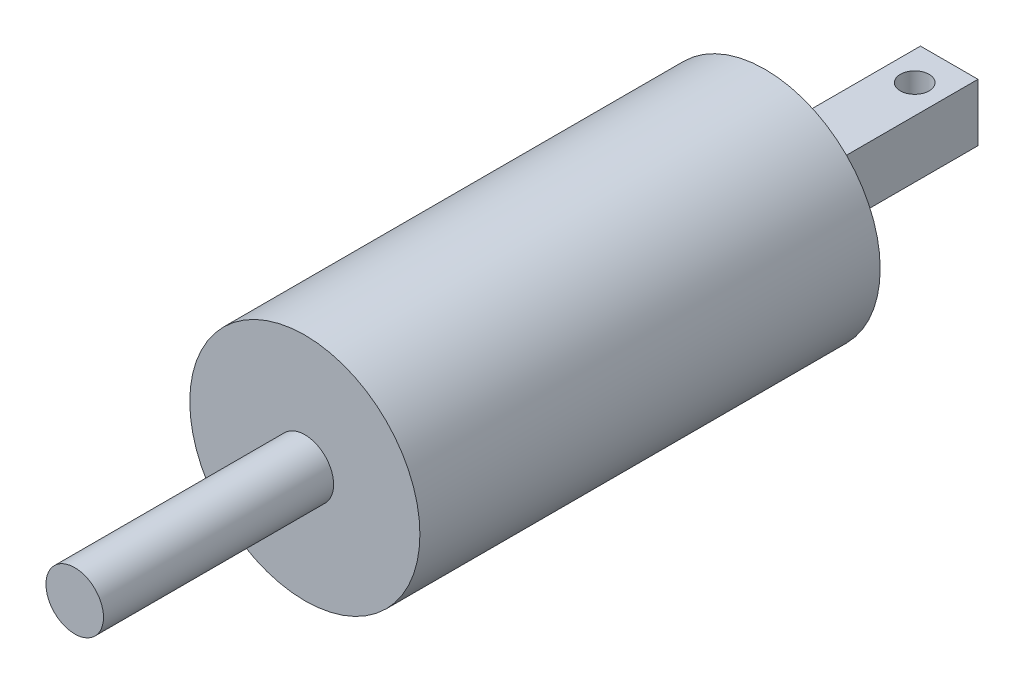
ISO-10303-21;
HEADER;
FILE_DESCRIPTION(('STEP AP214'),'2;1');
FILE_NAME('part.step','',(''),(''),'','','');
FILE_SCHEMA(('AUTOMOTIVE_DESIGN { 1 0 10303 214 1 1 1 1 }'));
ENDSEC;
DATA;
#1=APPLICATION_CONTEXT('core data for automotive mechanical design processes');
#2=APPLICATION_PROTOCOL_DEFINITION('international standard','automotive_design',2000,#1);
#3=PRODUCT_CONTEXT('',#1,'mechanical');
#4=PRODUCT('Part','Part','',(#3));
#5=PRODUCT_RELATED_PRODUCT_CATEGORY('part','',(#4));
#6=PRODUCT_DEFINITION_FORMATION('','',#4);
#7=PRODUCT_DEFINITION_CONTEXT('part definition',#1,'design');
#8=PRODUCT_DEFINITION('design','',#6,#7);
#9=PRODUCT_DEFINITION_SHAPE('','',#8);
#10=(LENGTH_UNIT() NAMED_UNIT(*) SI_UNIT(.MILLI.,.METRE.));
#11=(NAMED_UNIT(*) PLANE_ANGLE_UNIT() SI_UNIT($,.RADIAN.));
#12=(NAMED_UNIT(*) SI_UNIT($,.STERADIAN.) SOLID_ANGLE_UNIT());
#13=UNCERTAINTY_MEASURE_WITH_UNIT(LENGTH_MEASURE(1.E-05),#10,'distance_accuracy_value','');
#14=(GEOMETRIC_REPRESENTATION_CONTEXT(3) GLOBAL_UNCERTAINTY_ASSIGNED_CONTEXT((#13)) GLOBAL_UNIT_ASSIGNED_CONTEXT((#10,
#11,#12)) REPRESENTATION_CONTEXT('',''));
#15=CARTESIAN_POINT('',(0.,0.,0.));
#16=DIRECTION('',(0.,0.,1.));
#17=DIRECTION('',(1.,0.,0.));
#18=AXIS2_PLACEMENT_3D('',#15,#16,#17);
#19=CARTESIAN_POINT('',(0.,0.,-25.4));
#20=DIRECTION('',(0.,0.,1.));
#21=DIRECTION('',(1.,0.,0.));
#22=AXIS2_PLACEMENT_3D('',#19,#20,#21);
#23=PLANE('',#22);
#24=CARTESIAN_POINT('',(0.,0.,-25.4));
#25=DIRECTION('',(0.,0.,1.));
#26=DIRECTION('',(1.,0.,0.));
#27=AXIS2_PLACEMENT_3D('',#24,#25,#26);
#28=CIRCLE('',#27,12.7);
#29=CARTESIAN_POINT('',(12.7,0.,-25.4));
#30=VERTEX_POINT('',#29);
#31=EDGE_CURVE('E99',#30,#30,#28,.T.);
#32=ORIENTED_EDGE('',*,*,#31,.F.);
#33=EDGE_LOOP('',(#32));
#34=FACE_BOUND('',#33,.T.);
#35=DIRECTION('',(0.,1.,0.));
#36=VECTOR('',#35,1.);
#37=CARTESIAN_POINT('',(-3.175,-3.175,-25.4));
#38=LINE('',#37,#36);
#39=CARTESIAN_POINT('',(-3.175,-3.175,-25.4));
#40=VERTEX_POINT('',#39);
#41=CARTESIAN_POINT('',(-3.175,3.175,-25.4));
#42=VERTEX_POINT('',#41);
#43=EDGE_CURVE('E50',#40,#42,#38,.T.);
#44=ORIENTED_EDGE('',*,*,#43,.F.);
#45=DIRECTION('',(-1.,0.,0.));
#46=VECTOR('',#45,1.);
#47=CARTESIAN_POINT('',(3.175,-3.175,-25.4));
#48=LINE('',#47,#46);
#49=CARTESIAN_POINT('',(3.175,-3.175,-25.4));
#50=VERTEX_POINT('',#49);
#51=EDGE_CURVE('E54',#50,#40,#48,.T.);
#52=ORIENTED_EDGE('',*,*,#51,.F.);
#53=DIRECTION('',(0.,-1.,0.));
#54=VECTOR('',#53,1.);
#55=CARTESIAN_POINT('',(3.175,-3.175,-25.4));
#56=LINE('',#55,#54);
#57=CARTESIAN_POINT('',(3.175,3.175,-25.4));
#58=VERTEX_POINT('',#57);
#59=EDGE_CURVE('E162',#58,#50,#56,.T.);
#60=ORIENTED_EDGE('',*,*,#59,.F.);
#61=DIRECTION('',(1.,0.,0.));
#62=VECTOR('',#61,1.);
#63=CARTESIAN_POINT('',(3.175,3.175,-25.4));
#64=LINE('',#63,#62);
#65=EDGE_CURVE('E154',#42,#58,#64,.T.);
#66=ORIENTED_EDGE('',*,*,#65,.F.);
#67=EDGE_LOOP('',(#44,#52,#60,#66));
#68=FACE_BOUND('',#67,.T.);
#69=ADVANCED_FACE('F33',(#34,#68),#23,.F.);
#70=CARTESIAN_POINT('',(0.,0.,25.4));
#71=DIRECTION('',(0.,0.,-1.));
#72=DIRECTION('',(-1.,0.,0.));
#73=AXIS2_PLACEMENT_3D('',#70,#71,#72);
#74=CYLINDRICAL_SURFACE('',#73,12.7);
#75=CARTESIAN_POINT('',(0.,0.,25.4));
#76=DIRECTION('',(0.,0.,1.));
#77=DIRECTION('',(1.,0.,0.));
#78=AXIS2_PLACEMENT_3D('',#75,#76,#77);
#79=CIRCLE('',#78,12.7);
#80=CARTESIAN_POINT('',(12.7,0.,25.4));
#81=VERTEX_POINT('',#80);
#82=EDGE_CURVE('E42',#81,#81,#79,.T.);
#83=ORIENTED_EDGE('',*,*,#82,.F.);
#84=EDGE_LOOP('',(#83));
#85=FACE_BOUND('',#84,.T.);
#86=ORIENTED_EDGE('',*,*,#31,.T.);
#87=EDGE_LOOP('',(#86));
#88=FACE_BOUND('',#87,.T.);
#89=ADVANCED_FACE('F35',(#85,#88),#74,.T.);
#90=CARTESIAN_POINT('',(0.,0.,25.4));
#91=DIRECTION('',(0.,0.,1.));
#92=DIRECTION('',(1.,0.,0.));
#93=AXIS2_PLACEMENT_3D('',#90,#91,#92);
#94=PLANE('',#93);
#95=CARTESIAN_POINT('',(0.,0.,25.4));
#96=DIRECTION('',(0.,0.,1.));
#97=DIRECTION('',(1.,0.,0.));
#98=AXIS2_PLACEMENT_3D('',#95,#96,#97);
#99=CIRCLE('',#98,3.175);
#100=CARTESIAN_POINT('',(3.175,0.,25.4));
#101=VERTEX_POINT('',#100);
#102=EDGE_CURVE('E11',#101,#101,#99,.T.);
#103=ORIENTED_EDGE('',*,*,#102,.F.);
#104=EDGE_LOOP('',(#103));
#105=FACE_BOUND('',#104,.T.);
#106=ORIENTED_EDGE('',*,*,#82,.T.);
#107=EDGE_LOOP('',(#106));
#108=FACE_BOUND('',#107,.T.);
#109=ADVANCED_FACE('F114',(#105,#108),#94,.T.);
#110=CARTESIAN_POINT('',(0.,0.,50.8));
#111=DIRECTION('',(0.,0.,-1.));
#112=DIRECTION('',(-1.,0.,0.));
#113=AXIS2_PLACEMENT_3D('',#110,#111,#112);
#114=CYLINDRICAL_SURFACE('',#113,3.175);
#115=CARTESIAN_POINT('',(0.,0.,50.8));
#116=DIRECTION('',(0.,0.,1.));
#117=DIRECTION('',(1.,0.,0.));
#118=AXIS2_PLACEMENT_3D('',#115,#116,#117);
#119=CIRCLE('',#118,3.175);
#120=CARTESIAN_POINT('',(3.175,0.,50.8));
#121=VERTEX_POINT('',#120);
#122=EDGE_CURVE('E96',#121,#121,#119,.T.);
#123=ORIENTED_EDGE('',*,*,#122,.F.);
#124=EDGE_LOOP('',(#123));
#125=FACE_BOUND('',#124,.T.);
#126=ORIENTED_EDGE('',*,*,#102,.T.);
#127=EDGE_LOOP('',(#126));
#128=FACE_BOUND('',#127,.T.);
#129=ADVANCED_FACE('F119',(#125,#128),#114,.T.);
#130=CARTESIAN_POINT('',(0.,0.,50.8));
#131=DIRECTION('',(0.,0.,1.));
#132=DIRECTION('',(1.,0.,0.));
#133=AXIS2_PLACEMENT_3D('',#130,#131,#132);
#134=PLANE('',#133);
#135=ORIENTED_EDGE('',*,*,#122,.T.);
#136=EDGE_LOOP('',(#135));
#137=FACE_BOUND('',#136,.T.);
#138=ADVANCED_FACE('F123',(#137),#134,.T.);
#139=CARTESIAN_POINT('',(-3.175,-3.175,-45.72));
#140=DIRECTION('',(1.,0.,0.));
#141=DIRECTION('',(0.,0.,-1.));
#142=AXIS2_PLACEMENT_3D('',#139,#140,#141);
#143=PLANE('',#142);
#144=ORIENTED_EDGE('',*,*,#43,.T.);
#145=DIRECTION('',(0.,0.,1.));
#146=VECTOR('',#145,1.);
#147=CARTESIAN_POINT('',(-3.175,3.175,-45.72));
#148=LINE('',#147,#146);
#149=CARTESIAN_POINT('',(-3.175,3.175,-45.72));
#150=VERTEX_POINT('',#149);
#151=EDGE_CURVE('E79',#150,#42,#148,.T.);
#152=ORIENTED_EDGE('',*,*,#151,.F.);
#153=DIRECTION('',(0.,1.,0.));
#154=VECTOR('',#153,1.);
#155=CARTESIAN_POINT('',(-3.175,-3.175,-45.72));
#156=LINE('',#155,#154);
#157=CARTESIAN_POINT('',(-3.175,-3.175,-45.72));
#158=VERTEX_POINT('',#157);
#159=EDGE_CURVE('E85',#158,#150,#156,.T.);
#160=ORIENTED_EDGE('',*,*,#159,.F.);
#161=DIRECTION('',(0.,0.,1.));
#162=VECTOR('',#161,1.);
#163=CARTESIAN_POINT('',(-3.175,-3.175,-45.72));
#164=LINE('',#163,#162);
#165=EDGE_CURVE('E159',#158,#40,#164,.T.);
#166=ORIENTED_EDGE('',*,*,#165,.T.);
#167=EDGE_LOOP('',(#144,#152,#160,#166));
#168=FACE_BOUND('',#167,.T.);
#169=ADVANCED_FACE('F95',(#168),#143,.F.);
#170=CARTESIAN_POINT('',(3.175,3.175,-45.72));
#171=DIRECTION('',(0.,-1.,0.));
#172=DIRECTION('',(0.,0.,-1.));
#173=AXIS2_PLACEMENT_3D('',#170,#171,#172);
#174=PLANE('',#173);
#175=CARTESIAN_POINT('',(0.,3.175,-41.91));
#176=DIRECTION('',(0.,1.,0.));
#177=DIRECTION('',(0.,0.,1.));
#178=AXIS2_PLACEMENT_3D('',#175,#176,#177);
#179=CIRCLE('',#178,1.5875);
#180=CARTESIAN_POINT('',(0.,3.175,-40.3225));
#181=VERTEX_POINT('',#180);
#182=EDGE_CURVE('E151',#181,#181,#179,.T.);
#183=ORIENTED_EDGE('',*,*,#182,.F.);
#184=EDGE_LOOP('',(#183));
#185=FACE_BOUND('',#184,.T.);
#186=ORIENTED_EDGE('',*,*,#65,.T.);
#187=DIRECTION('',(0.,0.,1.));
#188=VECTOR('',#187,1.);
#189=CARTESIAN_POINT('',(3.175,3.175,-45.72));
#190=LINE('',#189,#188);
#191=CARTESIAN_POINT('',(3.175,3.175,-45.72));
#192=VERTEX_POINT('',#191);
#193=EDGE_CURVE('E81',#192,#58,#190,.T.);
#194=ORIENTED_EDGE('',*,*,#193,.F.);
#195=DIRECTION('',(1.,0.,0.));
#196=VECTOR('',#195,1.);
#197=CARTESIAN_POINT('',(3.175,3.175,-45.72));
#198=LINE('',#197,#196);
#199=EDGE_CURVE('E74',#150,#192,#198,.T.);
#200=ORIENTED_EDGE('',*,*,#199,.F.);
#201=ORIENTED_EDGE('',*,*,#151,.T.);
#202=EDGE_LOOP('',(#186,#194,#200,#201));
#203=FACE_BOUND('',#202,.T.);
#204=ADVANCED_FACE('F77',(#185,#203),#174,.F.);
#205=CARTESIAN_POINT('',(3.175,-3.175,-45.72));
#206=DIRECTION('',(-1.,0.,0.));
#207=DIRECTION('',(0.,0.,1.));
#208=AXIS2_PLACEMENT_3D('',#205,#206,#207);
#209=PLANE('',#208);
#210=ORIENTED_EDGE('',*,*,#59,.T.);
#211=DIRECTION('',(0.,0.,1.));
#212=VECTOR('',#211,1.);
#213=CARTESIAN_POINT('',(3.175,-3.175,-45.72));
#214=LINE('',#213,#212);
#215=CARTESIAN_POINT('',(3.175,-3.175,-45.72));
#216=VERTEX_POINT('',#215);
#217=EDGE_CURVE('E101',#216,#50,#214,.T.);
#218=ORIENTED_EDGE('',*,*,#217,.F.);
#219=DIRECTION('',(0.,-1.,0.));
#220=VECTOR('',#219,1.);
#221=CARTESIAN_POINT('',(3.175,-3.175,-45.72));
#222=LINE('',#221,#220);
#223=EDGE_CURVE('E84',#192,#216,#222,.T.);
#224=ORIENTED_EDGE('',*,*,#223,.F.);
#225=ORIENTED_EDGE('',*,*,#193,.T.);
#226=EDGE_LOOP('',(#210,#218,#224,#225));
#227=FACE_BOUND('',#226,.T.);
#228=ADVANCED_FACE('F132',(#227),#209,.F.);
#229=CARTESIAN_POINT('',(3.175,-3.175,-45.72));
#230=DIRECTION('',(0.,1.,0.));
#231=DIRECTION('',(0.,0.,1.));
#232=AXIS2_PLACEMENT_3D('',#229,#230,#231);
#233=PLANE('',#232);
#234=CARTESIAN_POINT('',(0.,-3.175,-41.91));
#235=DIRECTION('',(0.,1.,0.));
#236=DIRECTION('',(0.,0.,1.));
#237=AXIS2_PLACEMENT_3D('',#234,#235,#236);
#238=CIRCLE('',#237,1.5875);
#239=CARTESIAN_POINT('',(0.,-3.175,-40.3225));
#240=VERTEX_POINT('',#239);
#241=EDGE_CURVE('E37',#240,#240,#238,.T.);
#242=ORIENTED_EDGE('',*,*,#241,.T.);
#243=EDGE_LOOP('',(#242));
#244=FACE_BOUND('',#243,.T.);
#245=ORIENTED_EDGE('',*,*,#51,.T.);
#246=ORIENTED_EDGE('',*,*,#165,.F.);
#247=DIRECTION('',(-1.,0.,0.));
#248=VECTOR('',#247,1.);
#249=CARTESIAN_POINT('',(3.175,-3.175,-45.72));
#250=LINE('',#249,#248);
#251=EDGE_CURVE('E90',#216,#158,#250,.T.);
#252=ORIENTED_EDGE('',*,*,#251,.F.);
#253=ORIENTED_EDGE('',*,*,#217,.T.);
#254=EDGE_LOOP('',(#245,#246,#252,#253));
#255=FACE_BOUND('',#254,.T.);
#256=ADVANCED_FACE('F136',(#244,#255),#233,.F.);
#257=CARTESIAN_POINT('',(0.,0.,-45.72));
#258=DIRECTION('',(0.,0.,1.));
#259=DIRECTION('',(1.,0.,0.));
#260=AXIS2_PLACEMENT_3D('',#257,#258,#259);
#261=PLANE('',#260);
#262=ORIENTED_EDGE('',*,*,#159,.T.);
#263=ORIENTED_EDGE('',*,*,#199,.T.);
#264=ORIENTED_EDGE('',*,*,#223,.T.);
#265=ORIENTED_EDGE('',*,*,#251,.T.);
#266=EDGE_LOOP('',(#262,#263,#264,#265));
#267=FACE_BOUND('',#266,.T.);
#268=ADVANCED_FACE('F88',(#267),#261,.F.);
#269=CARTESIAN_POINT('',(0.,-12.7,-41.91));
#270=DIRECTION('',(0.,1.,0.));
#271=DIRECTION('',(0.,0.,1.));
#272=AXIS2_PLACEMENT_3D('',#269,#270,#271);
#273=CYLINDRICAL_SURFACE('',#272,1.5875);
#274=ORIENTED_EDGE('',*,*,#182,.T.);
#275=EDGE_LOOP('',(#274));
#276=FACE_BOUND('',#275,.T.);
#277=ORIENTED_EDGE('',*,*,#241,.F.);
#278=EDGE_LOOP('',(#277));
#279=FACE_BOUND('',#278,.T.);
#280=ADVANCED_FACE('F143',(#276,#279),#273,.F.);
#281=CLOSED_SHELL('',(#69,#89,#109,#129,#138,#169,#204,#228,#256,#268,#280));
#282=MANIFOLD_SOLID_BREP('B2',#281);
#283=ADVANCED_BREP_SHAPE_REPRESENTATION('',(#18,#282),#14);
#284=SHAPE_DEFINITION_REPRESENTATION(#9,#283);
ENDSEC;
END-ISO-10303-21;
